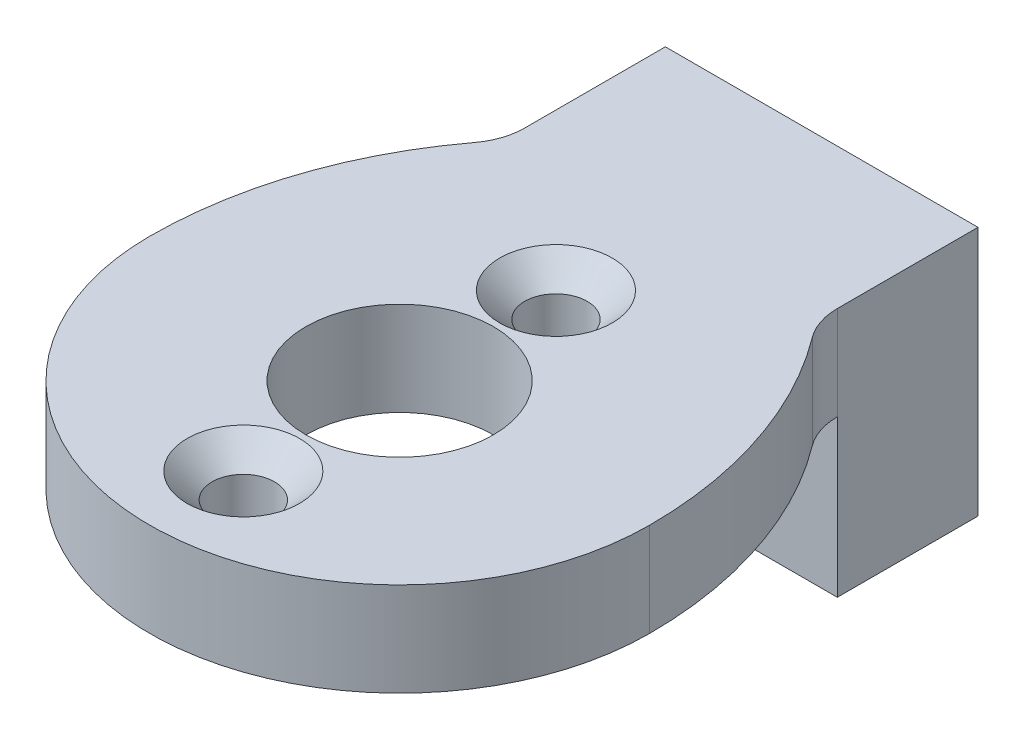
ISO-10303-21;
HEADER;
FILE_DESCRIPTION(('STEP AP214'),'2;1');
FILE_NAME('part.step','',(''),(''),'','','');
FILE_SCHEMA(('AUTOMOTIVE_DESIGN { 1 0 10303 214 1 1 1 1 }'));
ENDSEC;
DATA;
#1=APPLICATION_CONTEXT('core data for automotive mechanical design processes');
#2=APPLICATION_PROTOCOL_DEFINITION('international standard','automotive_design',2000,#1);
#3=PRODUCT_CONTEXT('',#1,'mechanical');
#4=PRODUCT('Part','Part','',(#3));
#5=PRODUCT_RELATED_PRODUCT_CATEGORY('part','',(#4));
#6=PRODUCT_DEFINITION_FORMATION('','',#4);
#7=PRODUCT_DEFINITION_CONTEXT('part definition',#1,'design');
#8=PRODUCT_DEFINITION('design','',#6,#7);
#9=PRODUCT_DEFINITION_SHAPE('','',#8);
#10=(LENGTH_UNIT() NAMED_UNIT(*) SI_UNIT(.MILLI.,.METRE.));
#11=(NAMED_UNIT(*) PLANE_ANGLE_UNIT() SI_UNIT($,.RADIAN.));
#12=(NAMED_UNIT(*) SI_UNIT($,.STERADIAN.) SOLID_ANGLE_UNIT());
#13=UNCERTAINTY_MEASURE_WITH_UNIT(LENGTH_MEASURE(1.E-05),#10,'distance_accuracy_value','');
#14=(GEOMETRIC_REPRESENTATION_CONTEXT(3) GLOBAL_UNCERTAINTY_ASSIGNED_CONTEXT((#13)) GLOBAL_UNIT_ASSIGNED_CONTEXT((#10,
#11,#12)) REPRESENTATION_CONTEXT('',''));
#15=CARTESIAN_POINT('',(0.,0.,0.));
#16=DIRECTION('',(0.,0.,1.));
#17=DIRECTION('',(1.,0.,0.));
#18=AXIS2_PLACEMENT_3D('',#15,#16,#17);
#19=CARTESIAN_POINT('',(-4.999999996736,0.,13.5));
#20=DIRECTION('',(0.,1.,0.));
#21=DIRECTION('',(0.,0.,1.));
#22=AXIS2_PLACEMENT_3D('',#19,#20,#21);
#23=PLANE('',#22);
#24=CARTESIAN_POINT('',(3.26400081725188E-09,0.,8.5));
#25=DIRECTION('',(0.,1.,0.));
#26=DIRECTION('',(0.,0.,1.));
#27=AXIS2_PLACEMENT_3D('',#24,#25,#26);
#28=CIRCLE('',#27,0.999999999999988);
#29=CARTESIAN_POINT('',(3.26400081725188E-09,0.,9.49999999999999));
#30=VERTEX_POINT('',#29);
#31=EDGE_CURVE('E41',#30,#30,#28,.T.);
#32=ORIENTED_EDGE('',*,*,#31,.T.);
#33=EDGE_LOOP('',(#32));
#34=FACE_BOUND('',#33,.T.);
#35=CARTESIAN_POINT('',(3.26400081725188E-09,0.,18.5));
#36=DIRECTION('',(0.,1.,0.));
#37=DIRECTION('',(0.,0.,1.));
#38=AXIS2_PLACEMENT_3D('',#35,#36,#37);
#39=CIRCLE('',#38,0.999999999999988);
#40=CARTESIAN_POINT('',(3.26400081725188E-09,0.,19.5));
#41=VERTEX_POINT('',#40);
#42=EDGE_CURVE('E126',#41,#41,#39,.T.);
#43=ORIENTED_EDGE('',*,*,#42,.T.);
#44=EDGE_LOOP('',(#43));
#45=FACE_BOUND('',#44,.T.);
#46=CARTESIAN_POINT('',(0.,0.,13.5));
#47=DIRECTION('',(0.,-1.,0.));
#48=DIRECTION('',(0.,0.,-1.));
#49=AXIS2_PLACEMENT_3D('',#46,#47,#48);
#50=CIRCLE('',#49,3.);
#51=CARTESIAN_POINT('',(0.,0.,10.5));
#52=VERTEX_POINT('',#51);
#53=EDGE_CURVE('E132',#52,#52,#50,.T.);
#54=ORIENTED_EDGE('',*,*,#53,.F.);
#55=EDGE_LOOP('',(#54));
#56=FACE_BOUND('',#55,.T.);
#57=DIRECTION('',(-1.,0.,0.));
#58=VECTOR('',#57,1.);
#59=CARTESIAN_POINT('',(-5.,0.,4.5));
#60=LINE('',#59,#58);
#61=CARTESIAN_POINT('',(5.000000003264,0.,4.5));
#62=VERTEX_POINT('',#61);
#63=CARTESIAN_POINT('',(-5.,0.,4.5));
#64=VERTEX_POINT('',#63);
#65=EDGE_CURVE('E138',#62,#64,#60,.T.);
#66=ORIENTED_EDGE('',*,*,#65,.F.);
#67=CARTESIAN_POINT('',(7.000000003264,0.,4.5));
#68=DIRECTION('',(0.,1.,0.));
#69=DIRECTION('',(0.,0.,1.));
#70=AXIS2_PLACEMENT_3D('',#67,#68,#69);
#71=CIRCLE('',#70,2.);
#72=CARTESIAN_POINT('',(5.400000003264,0.,5.69999999999999));
#73=VERTEX_POINT('',#72);
#74=EDGE_CURVE('E186',#62,#73,#71,.T.);
#75=ORIENTED_EDGE('',*,*,#74,.T.);
#76=CARTESIAN_POINT('',(-4.999999996736,0.,13.5));
#77=DIRECTION('',(0.,1.,0.));
#78=DIRECTION('',(0.,0.,1.));
#79=AXIS2_PLACEMENT_3D('',#76,#77,#78);
#80=CIRCLE('',#79,13.);
#81=CARTESIAN_POINT('',(8.000000003264,0.,13.5));
#82=VERTEX_POINT('',#81);
#83=EDGE_CURVE('E152',#82,#73,#80,.T.);
#84=ORIENTED_EDGE('',*,*,#83,.F.);
#85=CARTESIAN_POINT('',(3.26400081725188E-09,0.,13.5));
#86=DIRECTION('',(0.,1.,0.));
#87=DIRECTION('',(0.,0.,1.));
#88=AXIS2_PLACEMENT_3D('',#85,#86,#87);
#89=CIRCLE('',#88,8.);
#90=CARTESIAN_POINT('',(-7.999999996736,0.,13.5));
#91=VERTEX_POINT('',#90);
#92=EDGE_CURVE('E233',#91,#82,#89,.T.);
#93=ORIENTED_EDGE('',*,*,#92,.F.);
#94=CARTESIAN_POINT('',(5.000000003264,0.,13.5));
#95=DIRECTION('',(0.,1.,0.));
#96=DIRECTION('',(0.,0.,1.));
#97=AXIS2_PLACEMENT_3D('',#94,#95,#96);
#98=CIRCLE('',#97,13.);
#99=CARTESIAN_POINT('',(-5.399999996736,0.,5.69999999999999));
#100=VERTEX_POINT('',#99);
#101=EDGE_CURVE('E254',#100,#91,#98,.T.);
#102=ORIENTED_EDGE('',*,*,#101,.F.);
#103=CARTESIAN_POINT('',(-6.99999999673599,0.,4.49999999999999));
#104=DIRECTION('',(0.,1.,0.));
#105=DIRECTION('',(0.,0.,1.));
#106=AXIS2_PLACEMENT_3D('',#103,#104,#105);
#107=CIRCLE('',#106,2.);
#108=EDGE_CURVE('E11',#100,#64,#107,.T.);
#109=ORIENTED_EDGE('',*,*,#108,.T.);
#110=EDGE_LOOP('',(#66,#75,#84,#93,#102,#109));
#111=FACE_BOUND('',#110,.T.);
#112=ADVANCED_FACE('F37',(#34,#45,#56,#111),#23,.F.);
#113=CARTESIAN_POINT('',(-4.999999996736,0.,13.5));
#114=DIRECTION('',(0.,1.,0.));
#115=DIRECTION('',(0.,0.,1.));
#116=AXIS2_PLACEMENT_3D('',#113,#114,#115);
#117=CYLINDRICAL_SURFACE('',#116,13.);
#118=ORIENTED_EDGE('',*,*,#83,.T.);
#119=DIRECTION('',(0.,1.,0.));
#120=VECTOR('',#119,1.);
#121=CARTESIAN_POINT('',(5.400000003264,0.,5.7));
#122=LINE('',#121,#120);
#123=CARTESIAN_POINT('',(5.400000003264,3.,5.69999999999999));
#124=VERTEX_POINT('',#123);
#125=EDGE_CURVE('E170',#73,#124,#122,.T.);
#126=ORIENTED_EDGE('',*,*,#125,.T.);
#127=CARTESIAN_POINT('',(-4.999999996736,3.,13.5));
#128=DIRECTION('',(0.,1.,0.));
#129=DIRECTION('',(0.,0.,1.));
#130=AXIS2_PLACEMENT_3D('',#127,#128,#129);
#131=CIRCLE('',#130,13.);
#132=CARTESIAN_POINT('',(8.000000003264,3.,13.5));
#133=VERTEX_POINT('',#132);
#134=EDGE_CURVE('E167',#133,#124,#131,.T.);
#135=ORIENTED_EDGE('',*,*,#134,.F.);
#136=DIRECTION('',(0.,1.,0.));
#137=VECTOR('',#136,1.);
#138=CARTESIAN_POINT('',(8.000000003264,0.,13.5));
#139=LINE('',#138,#137);
#140=EDGE_CURVE('E174',#82,#133,#139,.T.);
#141=ORIENTED_EDGE('',*,*,#140,.F.);
#142=EDGE_LOOP('',(#118,#126,#135,#141));
#143=FACE_BOUND('',#142,.T.);
#144=ADVANCED_FACE('F261',(#143),#117,.T.);
#145=CARTESIAN_POINT('',(3.26400081725188E-09,0.,13.5));
#146=DIRECTION('',(0.,1.,0.));
#147=DIRECTION('',(0.,0.,1.));
#148=AXIS2_PLACEMENT_3D('',#145,#146,#147);
#149=CYLINDRICAL_SURFACE('',#148,8.);
#150=CARTESIAN_POINT('',(3.26400081725188E-09,3.,13.5));
#151=DIRECTION('',(0.,1.,0.));
#152=DIRECTION('',(0.,0.,1.));
#153=AXIS2_PLACEMENT_3D('',#150,#151,#152);
#154=CIRCLE('',#153,8.);
#155=CARTESIAN_POINT('',(-7.999999996736,3.,13.5));
#156=VERTEX_POINT('',#155);
#157=EDGE_CURVE('E226',#156,#133,#154,.T.);
#158=ORIENTED_EDGE('',*,*,#157,.F.);
#159=DIRECTION('',(0.,1.,0.));
#160=VECTOR('',#159,1.);
#161=CARTESIAN_POINT('',(-7.999999996736,0.,13.5));
#162=LINE('',#161,#160);
#163=EDGE_CURVE('E243',#91,#156,#162,.T.);
#164=ORIENTED_EDGE('',*,*,#163,.F.);
#165=ORIENTED_EDGE('',*,*,#92,.T.);
#166=ORIENTED_EDGE('',*,*,#140,.T.);
#167=EDGE_LOOP('',(#158,#164,#165,#166));
#168=FACE_BOUND('',#167,.T.);
#169=ADVANCED_FACE('F295',(#168),#149,.T.);
#170=CARTESIAN_POINT('',(5.000000003264,0.,13.5));
#171=DIRECTION('',(0.,1.,0.));
#172=DIRECTION('',(0.,0.,1.));
#173=AXIS2_PLACEMENT_3D('',#170,#171,#172);
#174=CYLINDRICAL_SURFACE('',#173,13.);
#175=CARTESIAN_POINT('',(5.000000003264,3.,13.5));
#176=DIRECTION('',(0.,1.,0.));
#177=DIRECTION('',(0.,0.,1.));
#178=AXIS2_PLACEMENT_3D('',#175,#176,#177);
#179=CIRCLE('',#178,13.);
#180=CARTESIAN_POINT('',(-5.399999996736,3.,5.69999999999999));
#181=VERTEX_POINT('',#180);
#182=EDGE_CURVE('E239',#181,#156,#179,.T.);
#183=ORIENTED_EDGE('',*,*,#182,.F.);
#184=DIRECTION('',(0.,1.,0.));
#185=VECTOR('',#184,1.);
#186=CARTESIAN_POINT('',(-5.39999999673599,0.,5.7));
#187=LINE('',#186,#185);
#188=EDGE_CURVE('E54',#181,#100,#187,.F.);
#189=ORIENTED_EDGE('',*,*,#188,.T.);
#190=ORIENTED_EDGE('',*,*,#101,.T.);
#191=ORIENTED_EDGE('',*,*,#163,.T.);
#192=EDGE_LOOP('',(#183,#189,#190,#191));
#193=FACE_BOUND('',#192,.T.);
#194=ADVANCED_FACE('F303',(#193),#174,.T.);
#195=CARTESIAN_POINT('',(-4.999999996736,0.,0.));
#196=DIRECTION('',(-1.,0.,0.));
#197=DIRECTION('',(0.,0.,1.));
#198=AXIS2_PLACEMENT_3D('',#195,#196,#197);
#199=PLANE('',#198);
#200=DIRECTION('',(0.,1.,0.));
#201=VECTOR('',#200,1.);
#202=CARTESIAN_POINT('',(-5.,-5.,4.5));
#203=LINE('',#202,#201);
#204=CARTESIAN_POINT('',(-5.,-5.,4.5));
#205=VERTEX_POINT('',#204);
#206=EDGE_CURVE('E149',#205,#64,#203,.T.);
#207=ORIENTED_EDGE('',*,*,#206,.T.);
#208=DIRECTION('',(0.,-1.,0.));
#209=VECTOR('',#208,1.);
#210=CARTESIAN_POINT('',(-4.999999996736,3.,4.49999999999999));
#211=LINE('',#210,#209);
#212=CARTESIAN_POINT('',(-4.999999996736,3.,4.49999999999999));
#213=VERTEX_POINT('',#212);
#214=EDGE_CURVE('E176',#64,#213,#211,.F.);
#215=ORIENTED_EDGE('',*,*,#214,.T.);
#216=DIRECTION('',(0.,0.,1.));
#217=VECTOR('',#216,1.);
#218=CARTESIAN_POINT('',(-4.999999996736,3.,0.));
#219=LINE('',#218,#217);
#220=CARTESIAN_POINT('',(-4.999999996736,3.,0.));
#221=VERTEX_POINT('',#220);
#222=EDGE_CURVE('E237',#221,#213,#219,.T.);
#223=ORIENTED_EDGE('',*,*,#222,.F.);
#224=DIRECTION('',(0.,1.,0.));
#225=VECTOR('',#224,1.);
#226=CARTESIAN_POINT('',(-4.999999996736,0.,0.));
#227=LINE('',#226,#225);
#228=CARTESIAN_POINT('',(-5.,-5.,0.));
#229=VERTEX_POINT('',#228);
#230=EDGE_CURVE('E245',#229,#221,#227,.T.);
#231=ORIENTED_EDGE('',*,*,#230,.F.);
#232=DIRECTION('',(0.,0.,-1.));
#233=VECTOR('',#232,1.);
#234=CARTESIAN_POINT('',(-5.,-5.,0.));
#235=LINE('',#234,#233);
#236=EDGE_CURVE('E146',#205,#229,#235,.T.);
#237=ORIENTED_EDGE('',*,*,#236,.F.);
#238=EDGE_LOOP('',(#207,#215,#223,#231,#237));
#239=FACE_BOUND('',#238,.T.);
#240=ADVANCED_FACE('F278',(#239),#199,.T.);
#241=CARTESIAN_POINT('',(5.000000003264,0.,0.));
#242=DIRECTION('',(0.,0.,-1.));
#243=DIRECTION('',(-1.,0.,0.));
#244=AXIS2_PLACEMENT_3D('',#241,#242,#243);
#245=PLANE('',#244);
#246=CARTESIAN_POINT('',(-3.,1.,0.));
#247=DIRECTION('',(0.,0.,-1.));
#248=DIRECTION('',(-1.,0.,0.));
#249=AXIS2_PLACEMENT_3D('',#246,#247,#248);
#250=CIRCLE('',#249,0.79999999999999);
#251=CARTESIAN_POINT('',(-3.79999999999999,1.,0.));
#252=VERTEX_POINT('',#251);
#253=EDGE_CURVE('E120',#252,#252,#250,.T.);
#254=ORIENTED_EDGE('',*,*,#253,.F.);
#255=EDGE_LOOP('',(#254));
#256=FACE_BOUND('',#255,.T.);
#257=CARTESIAN_POINT('',(1.5,-2.,0.));
#258=DIRECTION('',(0.,0.,-1.));
#259=DIRECTION('',(-1.,0.,0.));
#260=AXIS2_PLACEMENT_3D('',#257,#258,#259);
#261=CIRCLE('',#260,1.24999999999999);
#262=CARTESIAN_POINT('',(0.250000000000013,-2.,0.));
#263=VERTEX_POINT('',#262);
#264=EDGE_CURVE('E119',#263,#263,#261,.T.);
#265=ORIENTED_EDGE('',*,*,#264,.F.);
#266=EDGE_LOOP('',(#265));
#267=FACE_BOUND('',#266,.T.);
#268=DIRECTION('',(-1.,0.,0.));
#269=VECTOR('',#268,1.);
#270=CARTESIAN_POINT('',(5.000000003264,3.,0.));
#271=LINE('',#270,#269);
#272=CARTESIAN_POINT('',(5.000000003264,3.,0.));
#273=VERTEX_POINT('',#272);
#274=EDGE_CURVE('E230',#273,#221,#271,.T.);
#275=ORIENTED_EDGE('',*,*,#274,.F.);
#276=DIRECTION('',(0.,1.,0.));
#277=VECTOR('',#276,1.);
#278=CARTESIAN_POINT('',(5.000000003264,0.,0.));
#279=LINE('',#278,#277);
#280=CARTESIAN_POINT('',(5.,-5.,0.));
#281=VERTEX_POINT('',#280);
#282=EDGE_CURVE('E158',#281,#273,#279,.T.);
#283=ORIENTED_EDGE('',*,*,#282,.F.);
#284=DIRECTION('',(1.,0.,0.));
#285=VECTOR('',#284,1.);
#286=CARTESIAN_POINT('',(5.,-5.,0.));
#287=LINE('',#286,#285);
#288=EDGE_CURVE('E139',#229,#281,#287,.T.);
#289=ORIENTED_EDGE('',*,*,#288,.F.);
#290=ORIENTED_EDGE('',*,*,#230,.T.);
#291=EDGE_LOOP('',(#275,#283,#289,#290));
#292=FACE_BOUND('',#291,.T.);
#293=ADVANCED_FACE('F276',(#256,#267,#292),#245,.T.);
#294=CARTESIAN_POINT('',(5.000000003264,0.,5.19337613708192));
#295=DIRECTION('',(1.,0.,0.));
#296=DIRECTION('',(0.,0.,-1.));
#297=AXIS2_PLACEMENT_3D('',#294,#295,#296);
#298=PLANE('',#297);
#299=DIRECTION('',(0.,0.,-1.));
#300=VECTOR('',#299,1.);
#301=CARTESIAN_POINT('',(5.000000003264,3.,5.19337613708192));
#302=LINE('',#301,#300);
#303=CARTESIAN_POINT('',(5.000000003264,3.,4.5));
#304=VERTEX_POINT('',#303);
#305=EDGE_CURVE('E228',#304,#273,#302,.T.);
#306=ORIENTED_EDGE('',*,*,#305,.F.);
#307=DIRECTION('',(0.,-1.,0.));
#308=VECTOR('',#307,1.);
#309=CARTESIAN_POINT('',(5.000000003264,0.,4.5));
#310=LINE('',#309,#308);
#311=EDGE_CURVE('E173',#304,#62,#310,.T.);
#312=ORIENTED_EDGE('',*,*,#311,.T.);
#313=DIRECTION('',(0.,1.,0.));
#314=VECTOR('',#313,1.);
#315=CARTESIAN_POINT('',(5.,-5.,4.5));
#316=LINE('',#315,#314);
#317=CARTESIAN_POINT('',(5.,-5.,4.5));
#318=VERTEX_POINT('',#317);
#319=EDGE_CURVE('E162',#318,#62,#316,.T.);
#320=ORIENTED_EDGE('',*,*,#319,.F.);
#321=DIRECTION('',(0.,0.,1.));
#322=VECTOR('',#321,1.);
#323=CARTESIAN_POINT('',(5.,-5.,4.5));
#324=LINE('',#323,#322);
#325=EDGE_CURVE('E142',#281,#318,#324,.T.);
#326=ORIENTED_EDGE('',*,*,#325,.F.);
#327=ORIENTED_EDGE('',*,*,#282,.T.);
#328=EDGE_LOOP('',(#306,#312,#320,#326,#327));
#329=FACE_BOUND('',#328,.T.);
#330=ADVANCED_FACE('F216',(#329),#298,.T.);
#331=CARTESIAN_POINT('',(-4.999999996736,3.,13.5));
#332=DIRECTION('',(0.,1.,0.));
#333=DIRECTION('',(0.,0.,1.));
#334=AXIS2_PLACEMENT_3D('',#331,#332,#333);
#335=PLANE('',#334);
#336=CARTESIAN_POINT('',(3.26400081725188E-09,3.,8.5));
#337=DIRECTION('',(0.,1.,0.));
#338=DIRECTION('',(0.,0.,1.));
#339=AXIS2_PLACEMENT_3D('',#336,#337,#338);
#340=CIRCLE('',#339,1.8);
#341=CARTESIAN_POINT('',(3.26400081725188E-09,3.,10.3));
#342=VERTEX_POINT('',#341);
#343=EDGE_CURVE('E206',#342,#342,#340,.T.);
#344=ORIENTED_EDGE('',*,*,#343,.F.);
#345=EDGE_LOOP('',(#344));
#346=FACE_BOUND('',#345,.T.);
#347=CARTESIAN_POINT('',(3.26400081725188E-09,3.,18.5));
#348=DIRECTION('',(0.,1.,0.));
#349=DIRECTION('',(0.,0.,1.));
#350=AXIS2_PLACEMENT_3D('',#347,#348,#349);
#351=CIRCLE('',#350,1.8);
#352=CARTESIAN_POINT('',(3.26400081725188E-09,3.,20.3));
#353=VERTEX_POINT('',#352);
#354=EDGE_CURVE('E197',#353,#353,#351,.T.);
#355=ORIENTED_EDGE('',*,*,#354,.F.);
#356=EDGE_LOOP('',(#355));
#357=FACE_BOUND('',#356,.T.);
#358=CARTESIAN_POINT('',(0.,3.,13.5));
#359=DIRECTION('',(0.,-1.,0.));
#360=DIRECTION('',(0.,0.,-1.));
#361=AXIS2_PLACEMENT_3D('',#358,#359,#360);
#362=CIRCLE('',#361,3.);
#363=CARTESIAN_POINT('',(0.,3.,10.5));
#364=VERTEX_POINT('',#363);
#365=EDGE_CURVE('E135',#364,#364,#362,.T.);
#366=ORIENTED_EDGE('',*,*,#365,.T.);
#367=EDGE_LOOP('',(#366));
#368=FACE_BOUND('',#367,.T.);
#369=ORIENTED_EDGE('',*,*,#134,.T.);
#370=CARTESIAN_POINT('',(7.000000003264,3.,4.5));
#371=DIRECTION('',(0.,1.,0.));
#372=DIRECTION('',(0.,0.,1.));
#373=AXIS2_PLACEMENT_3D('',#370,#371,#372);
#374=CIRCLE('',#373,2.);
#375=EDGE_CURVE('E184',#124,#304,#374,.F.);
#376=ORIENTED_EDGE('',*,*,#375,.T.);
#377=ORIENTED_EDGE('',*,*,#305,.T.);
#378=ORIENTED_EDGE('',*,*,#274,.T.);
#379=ORIENTED_EDGE('',*,*,#222,.T.);
#380=CARTESIAN_POINT('',(-6.99999999673599,3.,4.49999999999999));
#381=DIRECTION('',(0.,1.,0.));
#382=DIRECTION('',(0.,0.,1.));
#383=AXIS2_PLACEMENT_3D('',#380,#381,#382);
#384=CIRCLE('',#383,2.);
#385=EDGE_CURVE('E46',#213,#181,#384,.F.);
#386=ORIENTED_EDGE('',*,*,#385,.T.);
#387=ORIENTED_EDGE('',*,*,#182,.T.);
#388=ORIENTED_EDGE('',*,*,#157,.T.);
#389=EDGE_LOOP('',(#369,#376,#377,#378,#379,#386,#387,#388));
#390=FACE_BOUND('',#389,.T.);
#391=ADVANCED_FACE('F212',(#346,#357,#368,#390),#335,.T.);
#392=CARTESIAN_POINT('',(-5.,-5.,4.5));
#393=DIRECTION('',(0.,0.,-1.));
#394=DIRECTION('',(-1.,0.,0.));
#395=AXIS2_PLACEMENT_3D('',#392,#393,#394);
#396=PLANE('',#395);
#397=CARTESIAN_POINT('',(1.5,-2.,4.5));
#398=DIRECTION('',(0.,0.,-1.));
#399=DIRECTION('',(-1.,0.,0.));
#400=AXIS2_PLACEMENT_3D('',#397,#398,#399);
#401=CIRCLE('',#400,1.24999999999999);
#402=CARTESIAN_POINT('',(0.250000000000007,-2.,4.5));
#403=VERTEX_POINT('',#402);
#404=EDGE_CURVE('E123',#403,#403,#401,.T.);
#405=ORIENTED_EDGE('',*,*,#404,.T.);
#406=EDGE_LOOP('',(#405));
#407=FACE_BOUND('',#406,.T.);
#408=ORIENTED_EDGE('',*,*,#65,.T.);
#409=ORIENTED_EDGE('',*,*,#206,.F.);
#410=DIRECTION('',(-1.,0.,0.));
#411=VECTOR('',#410,1.);
#412=CARTESIAN_POINT('',(-5.,-5.,4.5));
#413=LINE('',#412,#411);
#414=EDGE_CURVE('E144',#318,#205,#413,.T.);
#415=ORIENTED_EDGE('',*,*,#414,.F.);
#416=ORIENTED_EDGE('',*,*,#319,.T.);
#417=EDGE_LOOP('',(#408,#409,#415,#416));
#418=FACE_BOUND('',#417,.T.);
#419=ADVANCED_FACE('F215',(#407,#418),#396,.F.);
#420=CARTESIAN_POINT('',(0.,-5.,0.));
#421=DIRECTION('',(0.,1.,0.));
#422=DIRECTION('',(0.,0.,1.));
#423=AXIS2_PLACEMENT_3D('',#420,#421,#422);
#424=PLANE('',#423);
#425=ORIENTED_EDGE('',*,*,#288,.T.);
#426=ORIENTED_EDGE('',*,*,#325,.T.);
#427=ORIENTED_EDGE('',*,*,#414,.T.);
#428=ORIENTED_EDGE('',*,*,#236,.T.);
#429=EDGE_LOOP('',(#425,#426,#427,#428));
#430=FACE_BOUND('',#429,.T.);
#431=ADVANCED_FACE('F275',(#430),#424,.F.);
#432=CARTESIAN_POINT('',(0.,0.,13.5));
#433=DIRECTION('',(0.,-1.,0.));
#434=DIRECTION('',(0.,0.,-1.));
#435=AXIS2_PLACEMENT_3D('',#432,#433,#434);
#436=CYLINDRICAL_SURFACE('',#435,3.);
#437=ORIENTED_EDGE('',*,*,#365,.F.);
#438=EDGE_LOOP('',(#437));
#439=FACE_BOUND('',#438,.T.);
#440=ORIENTED_EDGE('',*,*,#53,.T.);
#441=EDGE_LOOP('',(#440));
#442=FACE_BOUND('',#441,.T.);
#443=ADVANCED_FACE('F335',(#439,#442),#436,.F.);
#444=CARTESIAN_POINT('',(1.5,-2.,0.));
#445=DIRECTION('',(0.,0.,-1.));
#446=DIRECTION('',(-1.,0.,0.));
#447=AXIS2_PLACEMENT_3D('',#444,#445,#446);
#448=CYLINDRICAL_SURFACE('',#447,1.24999999999999);
#449=ORIENTED_EDGE('',*,*,#404,.F.);
#450=EDGE_LOOP('',(#449));
#451=FACE_BOUND('',#450,.T.);
#452=ORIENTED_EDGE('',*,*,#264,.T.);
#453=EDGE_LOOP('',(#452));
#454=FACE_BOUND('',#453,.T.);
#455=ADVANCED_FACE('F113',(#451,#454),#448,.F.);
#456=CARTESIAN_POINT('',(-3.,1.,5.2));
#457=DIRECTION('',(0.,0.,-1.));
#458=DIRECTION('',(-1.,0.,0.));
#459=AXIS2_PLACEMENT_3D('',#456,#457,#458);
#460=CONICAL_SURFACE('',#459,0.799999999999988,1.02974425867664);
#461=CARTESIAN_POINT('',(-3.,1.,5.68068849522205));
#462=VERTEX_POINT('',#461);
#463=VERTEX_LOOP('',#462);
#464=FACE_BOUND('',#463,.T.);
#465=CARTESIAN_POINT('',(-3.,1.,5.2));
#466=DIRECTION('',(0.,0.,-1.));
#467=DIRECTION('',(-1.,0.,0.));
#468=AXIS2_PLACEMENT_3D('',#465,#466,#467);
#469=CIRCLE('',#468,0.799999999999988);
#470=CARTESIAN_POINT('',(-3.79999999999999,1.,5.2));
#471=VERTEX_POINT('',#470);
#472=EDGE_CURVE('E117',#471,#471,#469,.T.);
#473=ORIENTED_EDGE('',*,*,#472,.T.);
#474=EDGE_LOOP('',(#473));
#475=FACE_BOUND('',#474,.T.);
#476=ADVANCED_FACE('F109',(#464,#475),#460,.F.);
#477=CARTESIAN_POINT('',(-3.,1.,0.));
#478=DIRECTION('',(0.,0.,-1.));
#479=DIRECTION('',(-1.,0.,0.));
#480=AXIS2_PLACEMENT_3D('',#477,#478,#479);
#481=CYLINDRICAL_SURFACE('',#480,0.799999999999989);
#482=ORIENTED_EDGE('',*,*,#472,.F.);
#483=EDGE_LOOP('',(#482));
#484=FACE_BOUND('',#483,.T.);
#485=ORIENTED_EDGE('',*,*,#253,.T.);
#486=EDGE_LOOP('',(#485));
#487=FACE_BOUND('',#486,.T.);
#488=ADVANCED_FACE('F112',(#484,#487),#481,.F.);
#489=CARTESIAN_POINT('',(7.000000003264,0.,4.5));
#490=DIRECTION('',(0.,1.,0.));
#491=DIRECTION('',(0.,0.,1.));
#492=AXIS2_PLACEMENT_3D('',#489,#490,#491);
#493=CYLINDRICAL_SURFACE('',#492,2.);
#494=ORIENTED_EDGE('',*,*,#74,.F.);
#495=ORIENTED_EDGE('',*,*,#311,.F.);
#496=ORIENTED_EDGE('',*,*,#375,.F.);
#497=ORIENTED_EDGE('',*,*,#125,.F.);
#498=EDGE_LOOP('',(#494,#495,#496,#497));
#499=FACE_BOUND('',#498,.T.);
#500=ADVANCED_FACE('F265',(#499),#493,.F.);
#501=CARTESIAN_POINT('',(-6.99999999673599,0.,4.49999999999999));
#502=DIRECTION('',(0.,1.,0.));
#503=DIRECTION('',(0.,0.,1.));
#504=AXIS2_PLACEMENT_3D('',#501,#502,#503);
#505=CYLINDRICAL_SURFACE('',#504,2.);
#506=ORIENTED_EDGE('',*,*,#108,.F.);
#507=ORIENTED_EDGE('',*,*,#188,.F.);
#508=ORIENTED_EDGE('',*,*,#385,.F.);
#509=ORIENTED_EDGE('',*,*,#214,.F.);
#510=EDGE_LOOP('',(#506,#507,#508,#509));
#511=FACE_BOUND('',#510,.T.);
#512=ADVANCED_FACE('F39',(#511),#505,.F.);
#513=CARTESIAN_POINT('',(3.26400081725188E-09,3.,18.5));
#514=DIRECTION('',(0.,1.,0.));
#515=DIRECTION('',(0.,0.,1.));
#516=AXIS2_PLACEMENT_3D('',#513,#514,#515);
#517=CYLINDRICAL_SURFACE('',#516,0.999999999999988);
#518=CARTESIAN_POINT('',(3.26400081725188E-09,2.19999999999999,18.5));
#519=DIRECTION('',(0.,1.,0.));
#520=DIRECTION('',(0.,0.,1.));
#521=AXIS2_PLACEMENT_3D('',#518,#519,#520);
#522=CIRCLE('',#521,0.999999999999989);
#523=CARTESIAN_POINT('',(3.26400081725188E-09,2.19999999999999,19.5));
#524=VERTEX_POINT('',#523);
#525=EDGE_CURVE('E193',#524,#524,#522,.T.);
#526=ORIENTED_EDGE('',*,*,#525,.T.);
#527=EDGE_LOOP('',(#526));
#528=FACE_BOUND('',#527,.T.);
#529=ORIENTED_EDGE('',*,*,#42,.F.);
#530=EDGE_LOOP('',(#529));
#531=FACE_BOUND('',#530,.T.);
#532=ADVANCED_FACE('F282',(#528,#531),#517,.F.);
#533=CARTESIAN_POINT('',(3.26400081725188E-09,3.,18.5));
#534=DIRECTION('',(0.,1.,0.));
#535=DIRECTION('',(0.,0.,1.));
#536=AXIS2_PLACEMENT_3D('',#533,#534,#535);
#537=CONICAL_SURFACE('',#536,1.8,0.785398163397448);
#538=ORIENTED_EDGE('',*,*,#525,.F.);
#539=EDGE_LOOP('',(#538));
#540=FACE_BOUND('',#539,.T.);
#541=ORIENTED_EDGE('',*,*,#354,.T.);
#542=EDGE_LOOP('',(#541));
#543=FACE_BOUND('',#542,.T.);
#544=ADVANCED_FACE('F287',(#540,#543),#537,.F.);
#545=CARTESIAN_POINT('',(3.26400081725188E-09,3.,8.5));
#546=DIRECTION('',(0.,1.,0.));
#547=DIRECTION('',(0.,0.,1.));
#548=AXIS2_PLACEMENT_3D('',#545,#546,#547);
#549=CYLINDRICAL_SURFACE('',#548,0.999999999999988);
#550=CARTESIAN_POINT('',(3.26400081725188E-09,2.19999999999999,8.5));
#551=DIRECTION('',(0.,1.,0.));
#552=DIRECTION('',(0.,0.,1.));
#553=AXIS2_PLACEMENT_3D('',#550,#551,#552);
#554=CIRCLE('',#553,0.999999999999989);
#555=CARTESIAN_POINT('',(3.26400081725188E-09,2.19999999999999,9.49999999999999));
#556=VERTEX_POINT('',#555);
#557=EDGE_CURVE('E203',#556,#556,#554,.T.);
#558=ORIENTED_EDGE('',*,*,#557,.T.);
#559=EDGE_LOOP('',(#558));
#560=FACE_BOUND('',#559,.T.);
#561=ORIENTED_EDGE('',*,*,#31,.F.);
#562=EDGE_LOOP('',(#561));
#563=FACE_BOUND('',#562,.T.);
#564=ADVANCED_FACE('F436',(#560,#563),#549,.F.);
#565=CARTESIAN_POINT('',(3.26400081725188E-09,3.,8.5));
#566=DIRECTION('',(0.,1.,0.));
#567=DIRECTION('',(0.,0.,1.));
#568=AXIS2_PLACEMENT_3D('',#565,#566,#567);
#569=CONICAL_SURFACE('',#568,1.8,0.785398163397448);
#570=ORIENTED_EDGE('',*,*,#557,.F.);
#571=EDGE_LOOP('',(#570));
#572=FACE_BOUND('',#571,.T.);
#573=ORIENTED_EDGE('',*,*,#343,.T.);
#574=EDGE_LOOP('',(#573));
#575=FACE_BOUND('',#574,.T.);
#576=ADVANCED_FACE('F210',(#572,#575),#569,.F.);
#577=CLOSED_SHELL('',(#112,#144,#169,#194,#240,#293,#330,#391,#419,#431,#443,#455,#476,#488,
#500,#512,#532,#544,#564,#576));
#578=MANIFOLD_SOLID_BREP('B2',#577);
#579=ADVANCED_BREP_SHAPE_REPRESENTATION('',(#18,#578),#14);
#580=SHAPE_DEFINITION_REPRESENTATION(#9,#579);
ENDSEC;
END-ISO-10303-21;
